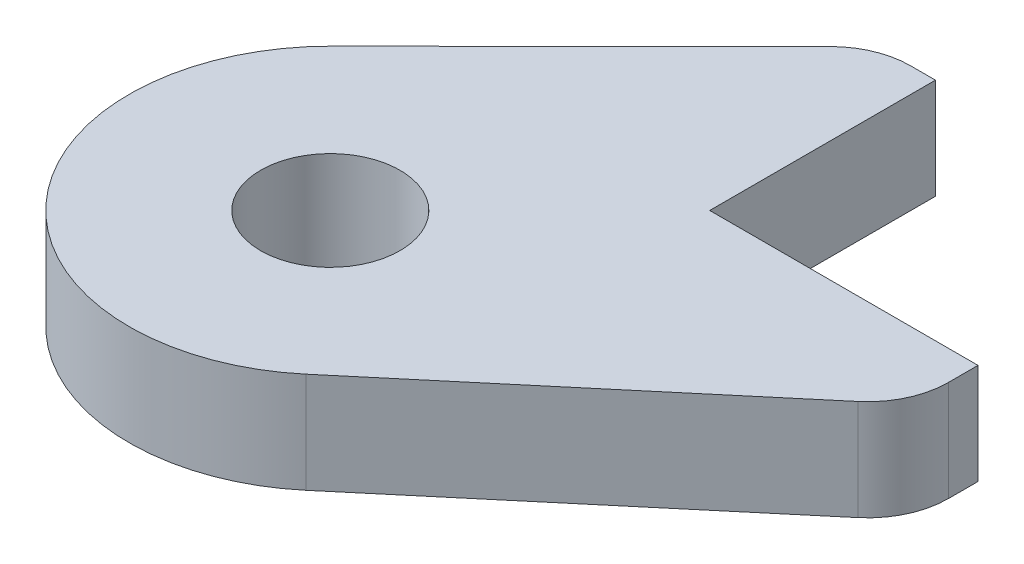
ISO-10303-21;
HEADER;
FILE_DESCRIPTION(('STEP AP214'),'2;1');
FILE_NAME('part.step','',(''),(''),'','','');
FILE_SCHEMA(('AUTOMOTIVE_DESIGN { 1 0 10303 214 1 1 1 1 }'));
ENDSEC;
DATA;
#1=APPLICATION_CONTEXT('core data for automotive mechanical design processes');
#2=APPLICATION_PROTOCOL_DEFINITION('international standard','automotive_design',2000,#1);
#3=PRODUCT_CONTEXT('',#1,'mechanical');
#4=PRODUCT('Part','Part','',(#3));
#5=PRODUCT_RELATED_PRODUCT_CATEGORY('part','',(#4));
#6=PRODUCT_DEFINITION_FORMATION('','',#4);
#7=PRODUCT_DEFINITION_CONTEXT('part definition',#1,'design');
#8=PRODUCT_DEFINITION('design','',#6,#7);
#9=PRODUCT_DEFINITION_SHAPE('','',#8);
#10=(LENGTH_UNIT() NAMED_UNIT(*) SI_UNIT(.MILLI.,.METRE.));
#11=(NAMED_UNIT(*) PLANE_ANGLE_UNIT() SI_UNIT($,.RADIAN.));
#12=(NAMED_UNIT(*) SI_UNIT($,.STERADIAN.) SOLID_ANGLE_UNIT());
#13=UNCERTAINTY_MEASURE_WITH_UNIT(LENGTH_MEASURE(1.E-05),#10,'distance_accuracy_value','');
#14=(GEOMETRIC_REPRESENTATION_CONTEXT(3) GLOBAL_UNCERTAINTY_ASSIGNED_CONTEXT((#13)) GLOBAL_UNIT_ASSIGNED_CONTEXT((#10,
#11,#12)) REPRESENTATION_CONTEXT('',''));
#15=CARTESIAN_POINT('',(0.,0.,0.));
#16=DIRECTION('',(0.,0.,1.));
#17=DIRECTION('',(1.,0.,0.));
#18=AXIS2_PLACEMENT_3D('',#15,#16,#17);
#19=CARTESIAN_POINT('',(-12.7,4.7625,12.7));
#20=DIRECTION('',(0.,0.,1.));
#21=DIRECTION('',(1.,0.,0.));
#22=AXIS2_PLACEMENT_3D('',#19,#20,#21);
#23=PLANE('',#22);
#24=DIRECTION('',(-1.,0.,0.));
#25=VECTOR('',#24,1.);
#26=CARTESIAN_POINT('',(-12.7,0.,12.7));
#27=LINE('',#26,#25);
#28=CARTESIAN_POINT('',(0.,0.,12.7));
#29=VERTEX_POINT('',#28);
#30=CARTESIAN_POINT('',(-12.7,0.,12.7));
#31=VERTEX_POINT('',#30);
#32=EDGE_CURVE('E134',#29,#31,#27,.T.);
#33=ORIENTED_EDGE('',*,*,#32,.T.);
#34=DIRECTION('',(0.,-1.,0.));
#35=VECTOR('',#34,1.);
#36=CARTESIAN_POINT('',(-12.7,4.7625,12.7));
#37=LINE('',#36,#35);
#38=CARTESIAN_POINT('',(-12.7,4.7625,12.7));
#39=VERTEX_POINT('',#38);
#40=EDGE_CURVE('E116',#39,#31,#37,.T.);
#41=ORIENTED_EDGE('',*,*,#40,.F.);
#42=DIRECTION('',(-1.,0.,0.));
#43=VECTOR('',#42,1.);
#44=CARTESIAN_POINT('',(-12.7,4.7625,12.7));
#45=LINE('',#44,#43);
#46=CARTESIAN_POINT('',(0.,4.7625,12.7));
#47=VERTEX_POINT('',#46);
#48=EDGE_CURVE('E121',#47,#39,#45,.T.);
#49=ORIENTED_EDGE('',*,*,#48,.F.);
#50=DIRECTION('',(0.,-1.,0.));
#51=VECTOR('',#50,1.);
#52=CARTESIAN_POINT('',(0.,4.7625,12.7));
#53=LINE('',#52,#51);
#54=EDGE_CURVE('E179',#47,#29,#53,.T.);
#55=ORIENTED_EDGE('',*,*,#54,.T.);
#56=EDGE_LOOP('',(#33,#41,#49,#55));
#57=FACE_BOUND('',#56,.T.);
#58=ADVANCED_FACE('F41',(#57),#23,.F.);
#59=CARTESIAN_POINT('',(-12.7,4.7625,2.01394877578617));
#60=DIRECTION('',(-1.,0.,0.));
#61=DIRECTION('',(0.,0.,1.));
#62=AXIS2_PLACEMENT_3D('',#59,#60,#61);
#63=PLANE('',#62);
#64=DIRECTION('',(0.,0.,-1.));
#65=VECTOR('',#64,1.);
#66=CARTESIAN_POINT('',(-12.7,0.,2.01394877578617));
#67=LINE('',#66,#65);
#68=CARTESIAN_POINT('',(-12.7,0.,2.01394877578617));
#69=VERTEX_POINT('',#68);
#70=EDGE_CURVE('E172',#31,#69,#67,.T.);
#71=ORIENTED_EDGE('',*,*,#70,.T.);
#72=DIRECTION('',(0.,-1.,0.));
#73=VECTOR('',#72,1.);
#74=CARTESIAN_POINT('',(-12.7,4.7625,2.01394877578617));
#75=LINE('',#74,#73);
#76=CARTESIAN_POINT('',(-12.7,4.7625,2.01394877578617));
#77=VERTEX_POINT('',#76);
#78=EDGE_CURVE('E119',#77,#69,#75,.T.);
#79=ORIENTED_EDGE('',*,*,#78,.F.);
#80=DIRECTION('',(0.,0.,-1.));
#81=VECTOR('',#80,1.);
#82=CARTESIAN_POINT('',(-12.7,4.7625,2.01394877578617));
#83=LINE('',#82,#81);
#84=EDGE_CURVE('E112',#39,#77,#83,.T.);
#85=ORIENTED_EDGE('',*,*,#84,.F.);
#86=ORIENTED_EDGE('',*,*,#40,.T.);
#87=EDGE_LOOP('',(#71,#79,#85,#86));
#88=FACE_BOUND('',#87,.T.);
#89=ADVANCED_FACE('F114',(#88),#63,.F.);
#90=CARTESIAN_POINT('',(-12.7,4.7625,2.01394877578617));
#91=DIRECTION('',(0.,0.,1.));
#92=DIRECTION('',(1.,0.,0.));
#93=AXIS2_PLACEMENT_3D('',#90,#91,#92);
#94=PLANE('',#93);
#95=DIRECTION('',(-1.,0.,0.));
#96=VECTOR('',#95,1.);
#97=CARTESIAN_POINT('',(-12.7,0.,2.01394877578617));
#98=LINE('',#97,#96);
#99=CARTESIAN_POINT('',(-13.8770783977473,0.,2.01394877578617));
#100=VERTEX_POINT('',#99);
#101=EDGE_CURVE('E168',#69,#100,#98,.T.);
#102=ORIENTED_EDGE('',*,*,#101,.T.);
#103=DIRECTION('',(0.,-1.,0.));
#104=VECTOR('',#103,1.);
#105=CARTESIAN_POINT('',(-13.8770783977473,4.7625,2.01394877578617));
#106=LINE('',#105,#104);
#107=CARTESIAN_POINT('',(-13.8770783977473,4.7625,2.01394877578617));
#108=VERTEX_POINT('',#107);
#109=EDGE_CURVE('E11',#100,#108,#106,.F.);
#110=ORIENTED_EDGE('',*,*,#109,.T.);
#111=DIRECTION('',(-1.,0.,0.));
#112=VECTOR('',#111,1.);
#113=CARTESIAN_POINT('',(-12.7,4.7625,2.01394877578617));
#114=LINE('',#113,#112);
#115=EDGE_CURVE('E120',#77,#108,#114,.T.);
#116=ORIENTED_EDGE('',*,*,#115,.F.);
#117=ORIENTED_EDGE('',*,*,#78,.T.);
#118=EDGE_LOOP('',(#102,#110,#116,#117));
#119=FACE_BOUND('',#118,.T.);
#120=ADVANCED_FACE('F197',(#119),#94,.F.);
#121=CARTESIAN_POINT('',(-15.4524870492753,4.7625,2.01394877578617));
#122=DIRECTION('',(0.706236330961077,0.,0.707976161202223));
#123=DIRECTION('',(0.707976161202223,0.,-0.706236330961077));
#124=AXIS2_PLACEMENT_3D('',#121,#122,#123);
#125=PLANE('',#124);
#126=DIRECTION('',(-0.707976161202223,0.,0.706236330961077));
#127=VECTOR('',#126,1.);
#128=CARTESIAN_POINT('',(-15.4524870492753,4.7625,2.01394877578617));
#129=LINE('',#128,#127);
#130=CARTESIAN_POINT('',(-16.567838818709,4.7625,3.1265596016057));
#131=VERTEX_POINT('',#130);
#132=CARTESIAN_POINT('',(-28.4071571734734,4.7625,14.936783185618));
#133=VERTEX_POINT('',#132);
#134=EDGE_CURVE('E159',#131,#133,#129,.T.);
#135=ORIENTED_EDGE('',*,*,#134,.F.);
#136=DIRECTION('',(0.,-1.,0.));
#137=VECTOR('',#136,1.);
#138=CARTESIAN_POINT('',(-16.567838818709,4.7625,3.1265596016057));
#139=LINE('',#138,#137);
#140=CARTESIAN_POINT('',(-16.567838818709,0.,3.1265596016057));
#141=VERTEX_POINT('',#140);
#142=EDGE_CURVE('E49',#131,#141,#139,.T.);
#143=ORIENTED_EDGE('',*,*,#142,.T.);
#144=DIRECTION('',(-0.707976161202223,0.,0.706236330961077));
#145=VECTOR('',#144,1.);
#146=CARTESIAN_POINT('',(-15.4524870492753,0.,2.01394877578617));
#147=LINE('',#146,#145);
#148=CARTESIAN_POINT('',(-28.4071571734734,0.,14.936783185618));
#149=VERTEX_POINT('',#148);
#150=EDGE_CURVE('E157',#141,#149,#147,.T.);
#151=ORIENTED_EDGE('',*,*,#150,.T.);
#152=DIRECTION('',(0.,-1.,0.));
#153=VECTOR('',#152,1.);
#154=CARTESIAN_POINT('',(-28.4071571734734,4.7625,14.936783185618));
#155=LINE('',#154,#153);
#156=EDGE_CURVE('E140',#133,#149,#155,.T.);
#157=ORIENTED_EDGE('',*,*,#156,.F.);
#158=EDGE_LOOP('',(#135,#143,#151,#157));
#159=FACE_BOUND('',#158,.T.);
#160=ADVANCED_FACE('F155',(#159),#125,.F.);
#161=CARTESIAN_POINT('',(-21.6802561210691,4.7625,21.6802561210691));
#162=DIRECTION('',(0.,-1.,0.));
#163=DIRECTION('',(0.,0.,-1.));
#164=AXIS2_PLACEMENT_3D('',#161,#162,#163);
#165=CYLINDRICAL_SURFACE('',#164,9.525);
#166=CARTESIAN_POINT('',(-21.6802561210691,0.,21.6802561210691));
#167=DIRECTION('',(0.,1.,0.));
#168=DIRECTION('',(0.,0.,1.));
#169=AXIS2_PLACEMENT_3D('',#166,#167,#168);
#170=CIRCLE('',#169,9.525);
#171=CARTESIAN_POINT('',(-15.5446919694414,0.,28.9658911339737));
#172=VERTEX_POINT('',#171);
#173=EDGE_CURVE('E167',#149,#172,#170,.T.);
#174=ORIENTED_EDGE('',*,*,#173,.T.);
#175=DIRECTION('',(0.,-1.,0.));
#176=VECTOR('',#175,1.);
#177=CARTESIAN_POINT('',(-15.5446919694414,4.7625,28.9658911339737));
#178=LINE('',#177,#176);
#179=CARTESIAN_POINT('',(-15.5446919694414,4.7625,28.9658911339737));
#180=VERTEX_POINT('',#179);
#181=EDGE_CURVE('E181',#180,#172,#178,.T.);
#182=ORIENTED_EDGE('',*,*,#181,.F.);
#183=CARTESIAN_POINT('',(-21.6802561210691,4.7625,21.6802561210691));
#184=DIRECTION('',(0.,1.,0.));
#185=DIRECTION('',(0.,0.,1.));
#186=AXIS2_PLACEMENT_3D('',#183,#184,#185);
#187=CIRCLE('',#186,9.525);
#188=EDGE_CURVE('E187',#133,#180,#187,.T.);
#189=ORIENTED_EDGE('',*,*,#188,.F.);
#190=ORIENTED_EDGE('',*,*,#156,.T.);
#191=EDGE_LOOP('',(#174,#182,#189,#190));
#192=FACE_BOUND('',#191,.T.);
#193=ADVANCED_FACE('F185',(#192),#165,.T.);
#194=CARTESIAN_POINT('',(0.,4.7625,15.875));
#195=DIRECTION('',(-0.644153716706325,0.,-0.764896064346933));
#196=DIRECTION('',(-0.764896064346933,0.,0.644153716706325));
#197=AXIS2_PLACEMENT_3D('',#194,#195,#196);
#198=PLANE('',#197);
#199=DIRECTION('',(0.764896064346933,0.,-0.644153716706325));
#200=VECTOR('',#199,1.);
#201=CARTESIAN_POINT('',(0.,0.,15.875));
#202=LINE('',#201,#200);
#203=CARTESIAN_POINT('',(-1.3557743393489,0.,17.0167591492673));
#204=VERTEX_POINT('',#203);
#205=EDGE_CURVE('E170',#172,#204,#202,.T.);
#206=ORIENTED_EDGE('',*,*,#205,.T.);
#207=DIRECTION('',(0.,-1.,0.));
#208=VECTOR('',#207,1.);
#209=CARTESIAN_POINT('',(-1.3557743393489,4.7625,17.0167591492673));
#210=LINE('',#209,#208);
#211=CARTESIAN_POINT('',(-1.3557743393489,4.7625,17.0167591492673));
#212=VERTEX_POINT('',#211);
#213=EDGE_CURVE('E147',#204,#212,#210,.F.);
#214=ORIENTED_EDGE('',*,*,#213,.T.);
#215=DIRECTION('',(0.764896064346933,0.,-0.644153716706325));
#216=VECTOR('',#215,1.);
#217=CARTESIAN_POINT('',(0.,4.7625,15.875));
#218=LINE('',#217,#216);
#219=EDGE_CURVE('E189',#180,#212,#218,.T.);
#220=ORIENTED_EDGE('',*,*,#219,.F.);
#221=ORIENTED_EDGE('',*,*,#181,.T.);
#222=EDGE_LOOP('',(#206,#214,#220,#221));
#223=FACE_BOUND('',#222,.T.);
#224=ADVANCED_FACE('F217',(#223),#198,.F.);
#225=CARTESIAN_POINT('',(0.,4.7625,12.7));
#226=DIRECTION('',(-1.,0.,0.));
#227=DIRECTION('',(0.,0.,1.));
#228=AXIS2_PLACEMENT_3D('',#225,#226,#227);
#229=PLANE('',#228);
#230=DIRECTION('',(0.,0.,-1.));
#231=VECTOR('',#230,1.);
#232=CARTESIAN_POINT('',(0.,4.7625,12.7));
#233=LINE('',#232,#231);
#234=CARTESIAN_POINT('',(0.,4.7625,14.1025051441055));
#235=VERTEX_POINT('',#234);
#236=EDGE_CURVE('E127',#235,#47,#233,.T.);
#237=ORIENTED_EDGE('',*,*,#236,.F.);
#238=DIRECTION('',(0.,-1.,0.));
#239=VECTOR('',#238,1.);
#240=CARTESIAN_POINT('',(0.,4.7625,14.1025051441055));
#241=LINE('',#240,#239);
#242=CARTESIAN_POINT('',(0.,0.,14.1025051441055));
#243=VERTEX_POINT('',#242);
#244=EDGE_CURVE('E135',#235,#243,#241,.T.);
#245=ORIENTED_EDGE('',*,*,#244,.T.);
#246=DIRECTION('',(0.,0.,-1.));
#247=VECTOR('',#246,1.);
#248=CARTESIAN_POINT('',(0.,0.,12.7));
#249=LINE('',#248,#247);
#250=EDGE_CURVE('E131',#243,#29,#249,.T.);
#251=ORIENTED_EDGE('',*,*,#250,.T.);
#252=ORIENTED_EDGE('',*,*,#54,.F.);
#253=EDGE_LOOP('',(#237,#245,#251,#252));
#254=FACE_BOUND('',#253,.T.);
#255=ADVANCED_FACE('F208',(#254),#229,.F.);
#256=CARTESIAN_POINT('',(-21.6802561210691,4.7625,21.6802561210691));
#257=DIRECTION('',(0.,1.,0.));
#258=DIRECTION('',(0.,0.,1.));
#259=AXIS2_PLACEMENT_3D('',#256,#257,#258);
#260=PLANE('',#259);
#261=CARTESIAN_POINT('',(-21.6802561210691,4.7625,21.6802561210691));
#262=DIRECTION('',(0.,1.,0.));
#263=DIRECTION('',(0.,0.,1.));
#264=AXIS2_PLACEMENT_3D('',#261,#262,#263);
#265=CIRCLE('',#264,3.29999999999999);
#266=CARTESIAN_POINT('',(-21.6802561210691,4.7625,24.9802561210691));
#267=VERTEX_POINT('',#266);
#268=EDGE_CURVE('E201',#267,#267,#265,.T.);
#269=ORIENTED_EDGE('',*,*,#268,.F.);
#270=EDGE_LOOP('',(#269));
#271=FACE_BOUND('',#270,.T.);
#272=ORIENTED_EDGE('',*,*,#219,.T.);
#273=CARTESIAN_POINT('',(-3.81,4.7625,14.1025051441055));
#274=DIRECTION('',(0.,1.,0.));
#275=DIRECTION('',(0.,0.,1.));
#276=AXIS2_PLACEMENT_3D('',#273,#274,#275);
#277=CIRCLE('',#276,3.81);
#278=EDGE_CURVE('E150',#212,#235,#277,.T.);
#279=ORIENTED_EDGE('',*,*,#278,.T.);
#280=ORIENTED_EDGE('',*,*,#236,.T.);
#281=ORIENTED_EDGE('',*,*,#48,.T.);
#282=ORIENTED_EDGE('',*,*,#84,.T.);
#283=ORIENTED_EDGE('',*,*,#115,.T.);
#284=CARTESIAN_POINT('',(-13.8770783977473,4.7625,5.82394877578617));
#285=DIRECTION('',(0.,1.,0.));
#286=DIRECTION('',(0.,0.,1.));
#287=AXIS2_PLACEMENT_3D('',#284,#285,#286);
#288=CIRCLE('',#287,3.81);
#289=EDGE_CURVE('E56',#108,#131,#288,.T.);
#290=ORIENTED_EDGE('',*,*,#289,.T.);
#291=ORIENTED_EDGE('',*,*,#134,.T.);
#292=ORIENTED_EDGE('',*,*,#188,.T.);
#293=EDGE_LOOP('',(#272,#279,#280,#281,#282,#283,#290,#291,#292));
#294=FACE_BOUND('',#293,.T.);
#295=ADVANCED_FACE('F125',(#271,#294),#260,.T.);
#296=CARTESIAN_POINT('',(-21.6802561210691,0.,21.6802561210691));
#297=DIRECTION('',(0.,1.,0.));
#298=DIRECTION('',(0.,0.,1.));
#299=AXIS2_PLACEMENT_3D('',#296,#297,#298);
#300=PLANE('',#299);
#301=CARTESIAN_POINT('',(-21.6802561210691,0.,21.6802561210691));
#302=DIRECTION('',(0.,1.,0.));
#303=DIRECTION('',(0.,0.,1.));
#304=AXIS2_PLACEMENT_3D('',#301,#302,#303);
#305=CIRCLE('',#304,3.3);
#306=CARTESIAN_POINT('',(-21.6802561210691,0.,24.9802561210691));
#307=VERTEX_POINT('',#306);
#308=EDGE_CURVE('E196',#307,#307,#305,.T.);
#309=ORIENTED_EDGE('',*,*,#308,.T.);
#310=EDGE_LOOP('',(#309));
#311=FACE_BOUND('',#310,.T.);
#312=ORIENTED_EDGE('',*,*,#250,.F.);
#313=CARTESIAN_POINT('',(-3.81,0.,14.1025051441055));
#314=DIRECTION('',(0.,1.,0.));
#315=DIRECTION('',(0.,0.,1.));
#316=AXIS2_PLACEMENT_3D('',#313,#314,#315);
#317=CIRCLE('',#316,3.81);
#318=EDGE_CURVE('E145',#243,#204,#317,.F.);
#319=ORIENTED_EDGE('',*,*,#318,.T.);
#320=ORIENTED_EDGE('',*,*,#205,.F.);
#321=ORIENTED_EDGE('',*,*,#173,.F.);
#322=ORIENTED_EDGE('',*,*,#150,.F.);
#323=CARTESIAN_POINT('',(-13.8770783977473,0.,5.82394877578617));
#324=DIRECTION('',(0.,1.,0.));
#325=DIRECTION('',(0.,0.,1.));
#326=AXIS2_PLACEMENT_3D('',#323,#324,#325);
#327=CIRCLE('',#326,3.81);
#328=EDGE_CURVE('E138',#141,#100,#327,.F.);
#329=ORIENTED_EDGE('',*,*,#328,.T.);
#330=ORIENTED_EDGE('',*,*,#101,.F.);
#331=ORIENTED_EDGE('',*,*,#70,.F.);
#332=ORIENTED_EDGE('',*,*,#32,.F.);
#333=EDGE_LOOP('',(#312,#319,#320,#321,#322,#329,#330,#331,#332));
#334=FACE_BOUND('',#333,.T.);
#335=ADVANCED_FACE('F164',(#311,#334),#300,.F.);
#336=CARTESIAN_POINT('',(-3.81,4.7625,14.1025051441055));
#337=DIRECTION('',(0.,-1.,0.));
#338=DIRECTION('',(0.,0.,-1.));
#339=AXIS2_PLACEMENT_3D('',#336,#337,#338);
#340=CYLINDRICAL_SURFACE('',#339,3.81);
#341=ORIENTED_EDGE('',*,*,#278,.F.);
#342=ORIENTED_EDGE('',*,*,#213,.F.);
#343=ORIENTED_EDGE('',*,*,#318,.F.);
#344=ORIENTED_EDGE('',*,*,#244,.F.);
#345=EDGE_LOOP('',(#341,#342,#343,#344));
#346=FACE_BOUND('',#345,.T.);
#347=ADVANCED_FACE('F214',(#346),#340,.T.);
#348=CARTESIAN_POINT('',(-13.8770783977473,4.7625,5.82394877578617));
#349=DIRECTION('',(0.,-1.,0.));
#350=DIRECTION('',(0.,0.,-1.));
#351=AXIS2_PLACEMENT_3D('',#348,#349,#350);
#352=CYLINDRICAL_SURFACE('',#351,3.81);
#353=ORIENTED_EDGE('',*,*,#289,.F.);
#354=ORIENTED_EDGE('',*,*,#109,.F.);
#355=ORIENTED_EDGE('',*,*,#328,.F.);
#356=ORIENTED_EDGE('',*,*,#142,.F.);
#357=EDGE_LOOP('',(#353,#354,#355,#356));
#358=FACE_BOUND('',#357,.T.);
#359=ADVANCED_FACE('F43',(#358),#352,.T.);
#360=CARTESIAN_POINT('',(-21.6802561210691,4.7625,21.6802561210691));
#361=DIRECTION('',(0.,1.,0.));
#362=DIRECTION('',(0.,0.,1.));
#363=AXIS2_PLACEMENT_3D('',#360,#361,#362);
#364=CYLINDRICAL_SURFACE('',#363,3.29999999999999);
#365=ORIENTED_EDGE('',*,*,#308,.F.);
#366=EDGE_LOOP('',(#365));
#367=FACE_BOUND('',#366,.T.);
#368=ORIENTED_EDGE('',*,*,#268,.T.);
#369=EDGE_LOOP('',(#368));
#370=FACE_BOUND('',#369,.T.);
#371=ADVANCED_FACE('F205',(#367,#370),#364,.F.);
#372=CLOSED_SHELL('',(#58,#89,#120,#160,#193,#224,#255,#295,#335,#347,#359,#371));
#373=MANIFOLD_SOLID_BREP('B2',#372);
#374=ADVANCED_BREP_SHAPE_REPRESENTATION('',(#18,#373),#14);
#375=SHAPE_DEFINITION_REPRESENTATION(#9,#374);
ENDSEC;
END-ISO-10303-21;
